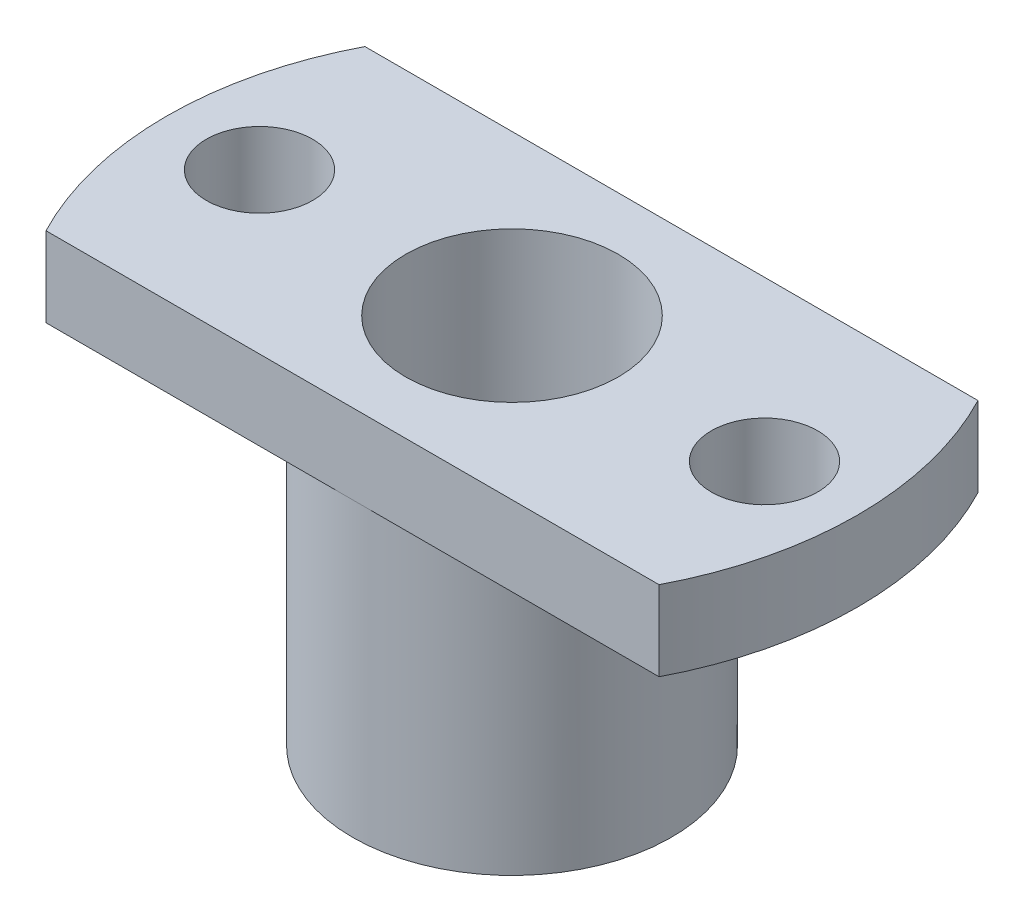
ISO-10303-21;
HEADER;
FILE_DESCRIPTION(('STEP AP214'),'2;1');
FILE_NAME('part.step','',(''),(''),'','','');
FILE_SCHEMA(('AUTOMOTIVE_DESIGN { 1 0 10303 214 1 1 1 1 }'));
ENDSEC;
DATA;
#1=APPLICATION_CONTEXT('core data for automotive mechanical design processes');
#2=APPLICATION_PROTOCOL_DEFINITION('international standard','automotive_design',2000,#1);
#3=PRODUCT_CONTEXT('',#1,'mechanical');
#4=PRODUCT('Part','Part','',(#3));
#5=PRODUCT_RELATED_PRODUCT_CATEGORY('part','',(#4));
#6=PRODUCT_DEFINITION_FORMATION('','',#4);
#7=PRODUCT_DEFINITION_CONTEXT('part definition',#1,'design');
#8=PRODUCT_DEFINITION('design','',#6,#7);
#9=PRODUCT_DEFINITION_SHAPE('','',#8);
#10=(LENGTH_UNIT() NAMED_UNIT(*) SI_UNIT(.MILLI.,.METRE.));
#11=(NAMED_UNIT(*) PLANE_ANGLE_UNIT() SI_UNIT($,.RADIAN.));
#12=(NAMED_UNIT(*) SI_UNIT($,.STERADIAN.) SOLID_ANGLE_UNIT());
#13=UNCERTAINTY_MEASURE_WITH_UNIT(LENGTH_MEASURE(1.E-05),#10,'distance_accuracy_value','');
#14=(GEOMETRIC_REPRESENTATION_CONTEXT(3) GLOBAL_UNCERTAINTY_ASSIGNED_CONTEXT((#13)) GLOBAL_UNIT_ASSIGNED_CONTEXT((#10,
#11,#12)) REPRESENTATION_CONTEXT('',''));
#15=CARTESIAN_POINT('',(0.,0.,0.));
#16=DIRECTION('',(0.,0.,1.));
#17=DIRECTION('',(1.,0.,0.));
#18=AXIS2_PLACEMENT_3D('',#15,#16,#17);
#19=CARTESIAN_POINT('',(0.,5.5,0.));
#20=DIRECTION('',(0.,-1.,0.));
#21=DIRECTION('',(0.,0.,-1.));
#22=AXIS2_PLACEMENT_3D('',#19,#20,#21);
#23=CYLINDRICAL_SURFACE('',#22,3.);
#24=CARTESIAN_POINT('',(0.,5.5,0.));
#25=DIRECTION('',(0.,1.,0.));
#26=DIRECTION('',(0.,0.,1.));
#27=AXIS2_PLACEMENT_3D('',#24,#25,#26);
#28=CIRCLE('',#27,3.);
#29=CARTESIAN_POINT('',(0.,5.5,3.));
#30=VERTEX_POINT('',#29);
#31=CARTESIAN_POINT('',(0.,5.5,-3.));
#32=VERTEX_POINT('',#31);
#33=EDGE_CURVE('E55',#30,#32,#28,.T.);
#34=ORIENTED_EDGE('',*,*,#33,.F.);
#35=EDGE_CURVE('E61',#32,#30,#28,.T.);
#36=ORIENTED_EDGE('',*,*,#35,.F.);
#37=EDGE_LOOP('',(#34,#36));
#38=FACE_BOUND('',#37,.T.);
#39=CARTESIAN_POINT('',(0.,0.,0.));
#40=DIRECTION('',(0.,1.,0.));
#41=DIRECTION('',(0.,0.,1.));
#42=AXIS2_PLACEMENT_3D('',#39,#40,#41);
#43=CIRCLE('',#42,3.);
#44=CARTESIAN_POINT('',(0.,0.,3.));
#45=VERTEX_POINT('',#44);
#46=EDGE_CURVE('E119',#45,#45,#43,.T.);
#47=ORIENTED_EDGE('',*,*,#46,.T.);
#48=EDGE_LOOP('',(#47));
#49=FACE_BOUND('',#48,.T.);
#50=ADVANCED_FACE('F45',(#38,#49),#23,.T.);
#51=CARTESIAN_POINT('',(0.,5.5,0.));
#52=DIRECTION('',(0.,-1.,0.));
#53=DIRECTION('',(0.,0.,-1.));
#54=AXIS2_PLACEMENT_3D('',#51,#52,#53);
#55=CYLINDRICAL_SURFACE('',#54,2.);
#56=CARTESIAN_POINT('',(0.,1.,0.));
#57=DIRECTION('',(0.,1.,0.));
#58=DIRECTION('',(0.,0.,1.));
#59=AXIS2_PLACEMENT_3D('',#56,#57,#58);
#60=CIRCLE('',#59,2.);
#61=CARTESIAN_POINT('',(0.,1.,2.));
#62=VERTEX_POINT('',#61);
#63=EDGE_CURVE('E11',#62,#62,#60,.F.);
#64=ORIENTED_EDGE('',*,*,#63,.T.);
#65=EDGE_LOOP('',(#64));
#66=FACE_BOUND('',#65,.T.);
#67=CARTESIAN_POINT('',(0.,7.,0.));
#68=DIRECTION('',(0.,1.,0.));
#69=DIRECTION('',(0.,0.,1.));
#70=AXIS2_PLACEMENT_3D('',#67,#68,#69);
#71=CIRCLE('',#70,2.);
#72=CARTESIAN_POINT('',(0.,7.,2.));
#73=VERTEX_POINT('',#72);
#74=EDGE_CURVE('E130',#73,#73,#71,.T.);
#75=ORIENTED_EDGE('',*,*,#74,.T.);
#76=EDGE_LOOP('',(#75));
#77=FACE_BOUND('',#76,.T.);
#78=ADVANCED_FACE('F194',(#66,#77),#55,.F.);
#79=CARTESIAN_POINT('',(0.,5.5,0.));
#80=DIRECTION('',(0.,1.,0.));
#81=DIRECTION('',(0.,0.,1.));
#82=AXIS2_PLACEMENT_3D('',#79,#80,#81);
#83=PLANE('',#82);
#84=CARTESIAN_POINT('',(4.75,5.5,0.));
#85=DIRECTION('',(0.,1.,0.));
#86=DIRECTION('',(0.,0.,1.));
#87=AXIS2_PLACEMENT_3D('',#84,#85,#86);
#88=CIRCLE('',#87,1.);
#89=CARTESIAN_POINT('',(4.75,5.5,0.999999999999998));
#90=VERTEX_POINT('',#89);
#91=EDGE_CURVE('E141',#90,#90,#88,.T.);
#92=ORIENTED_EDGE('',*,*,#91,.T.);
#93=EDGE_LOOP('',(#92));
#94=FACE_BOUND('',#93,.T.);
#95=DIRECTION('',(1.,0.,0.));
#96=VECTOR('',#95,1.);
#97=CARTESIAN_POINT('',(5.7662812973354,5.5,3.));
#98=LINE('',#97,#96);
#99=CARTESIAN_POINT('',(5.7662812973354,5.5,3.));
#100=VERTEX_POINT('',#99);
#101=EDGE_CURVE('E162',#30,#100,#98,.T.);
#102=ORIENTED_EDGE('',*,*,#101,.F.);
#103=ORIENTED_EDGE('',*,*,#33,.T.);
#104=DIRECTION('',(-1.,0.,0.));
#105=VECTOR('',#104,1.);
#106=CARTESIAN_POINT('',(5.7662812973354,5.5,-3.));
#107=LINE('',#106,#105);
#108=CARTESIAN_POINT('',(5.7662812973354,5.5,-3.));
#109=VERTEX_POINT('',#108);
#110=EDGE_CURVE('E156',#109,#32,#107,.T.);
#111=ORIENTED_EDGE('',*,*,#110,.F.);
#112=CARTESIAN_POINT('',(0.,5.5,0.));
#113=DIRECTION('',(0.,1.,0.));
#114=DIRECTION('',(0.,0.,1.));
#115=AXIS2_PLACEMENT_3D('',#112,#113,#114);
#116=CIRCLE('',#115,6.5);
#117=EDGE_CURVE('E117',#100,#109,#116,.T.);
#118=ORIENTED_EDGE('',*,*,#117,.F.);
#119=EDGE_LOOP('',(#102,#103,#111,#118));
#120=FACE_BOUND('',#119,.T.);
#121=ADVANCED_FACE('F181',(#94,#120),#83,.F.);
#122=CARTESIAN_POINT('',(-4.75,5.5,0.));
#123=DIRECTION('',(0.,1.,0.));
#124=DIRECTION('',(0.,0.,1.));
#125=AXIS2_PLACEMENT_3D('',#122,#123,#124);
#126=CIRCLE('',#125,1.);
#127=CARTESIAN_POINT('',(-4.75,5.5,1.));
#128=VERTEX_POINT('',#127);
#129=EDGE_CURVE('E133',#128,#128,#126,.T.);
#130=ORIENTED_EDGE('',*,*,#129,.T.);
#131=EDGE_LOOP('',(#130));
#132=FACE_BOUND('',#131,.T.);
#133=CARTESIAN_POINT('',(-5.7662812973354,5.5,-3.));
#134=VERTEX_POINT('',#133);
#135=EDGE_CURVE('E138',#32,#134,#107,.T.);
#136=ORIENTED_EDGE('',*,*,#135,.F.);
#137=ORIENTED_EDGE('',*,*,#35,.T.);
#138=CARTESIAN_POINT('',(-5.7662812973354,5.5,3.));
#139=VERTEX_POINT('',#138);
#140=EDGE_CURVE('E113',#139,#30,#98,.T.);
#141=ORIENTED_EDGE('',*,*,#140,.F.);
#142=CARTESIAN_POINT('',(0.,5.5,0.));
#143=DIRECTION('',(0.,1.,0.));
#144=DIRECTION('',(0.,0.,1.));
#145=AXIS2_PLACEMENT_3D('',#142,#143,#144);
#146=CIRCLE('',#145,6.5);
#147=EDGE_CURVE('E159',#134,#139,#146,.T.);
#148=ORIENTED_EDGE('',*,*,#147,.F.);
#149=EDGE_LOOP('',(#136,#137,#141,#148));
#150=FACE_BOUND('',#149,.T.);
#151=ADVANCED_FACE('F177',(#132,#150),#83,.F.);
#152=CARTESIAN_POINT('',(0.,7.,0.));
#153=DIRECTION('',(0.,-1.,0.));
#154=DIRECTION('',(0.,0.,-1.));
#155=AXIS2_PLACEMENT_3D('',#152,#153,#154);
#156=CYLINDRICAL_SURFACE('',#155,6.5);
#157=ORIENTED_EDGE('',*,*,#117,.T.);
#158=DIRECTION('',(0.,-1.,0.));
#159=VECTOR('',#158,1.);
#160=CARTESIAN_POINT('',(5.7662812973354,7.,-3.));
#161=LINE('',#160,#159);
#162=CARTESIAN_POINT('',(5.7662812973354,7.,-3.));
#163=VERTEX_POINT('',#162);
#164=EDGE_CURVE('E95',#163,#109,#161,.T.);
#165=ORIENTED_EDGE('',*,*,#164,.F.);
#166=CARTESIAN_POINT('',(0.,7.,0.));
#167=DIRECTION('',(0.,1.,0.));
#168=DIRECTION('',(0.,0.,1.));
#169=AXIS2_PLACEMENT_3D('',#166,#167,#168);
#170=CIRCLE('',#169,6.5);
#171=CARTESIAN_POINT('',(5.7662812973354,7.,3.));
#172=VERTEX_POINT('',#171);
#173=EDGE_CURVE('E103',#172,#163,#170,.T.);
#174=ORIENTED_EDGE('',*,*,#173,.F.);
#175=DIRECTION('',(0.,-1.,0.));
#176=VECTOR('',#175,1.);
#177=CARTESIAN_POINT('',(5.7662812973354,7.,3.));
#178=LINE('',#177,#176);
#179=EDGE_CURVE('E154',#172,#100,#178,.T.);
#180=ORIENTED_EDGE('',*,*,#179,.T.);
#181=EDGE_LOOP('',(#157,#165,#174,#180));
#182=FACE_BOUND('',#181,.T.);
#183=ADVANCED_FACE('F115',(#182),#156,.T.);
#184=CARTESIAN_POINT('',(5.7662812973354,7.,-3.));
#185=DIRECTION('',(0.,0.,1.));
#186=DIRECTION('',(1.,0.,0.));
#187=AXIS2_PLACEMENT_3D('',#184,#185,#186);
#188=PLANE('',#187);
#189=ORIENTED_EDGE('',*,*,#110,.T.);
#190=ORIENTED_EDGE('',*,*,#135,.T.);
#191=DIRECTION('',(0.,-1.,0.));
#192=VECTOR('',#191,1.);
#193=CARTESIAN_POINT('',(-5.7662812973354,7.,-3.));
#194=LINE('',#193,#192);
#195=CARTESIAN_POINT('',(-5.7662812973354,7.,-3.));
#196=VERTEX_POINT('',#195);
#197=EDGE_CURVE('E98',#196,#134,#194,.T.);
#198=ORIENTED_EDGE('',*,*,#197,.F.);
#199=DIRECTION('',(-1.,0.,0.));
#200=VECTOR('',#199,1.);
#201=CARTESIAN_POINT('',(5.7662812973354,7.,-3.));
#202=LINE('',#201,#200);
#203=EDGE_CURVE('E90',#163,#196,#202,.T.);
#204=ORIENTED_EDGE('',*,*,#203,.F.);
#205=ORIENTED_EDGE('',*,*,#164,.T.);
#206=EDGE_LOOP('',(#189,#190,#198,#204,#205));
#207=FACE_BOUND('',#206,.T.);
#208=ADVANCED_FACE('F93',(#207),#188,.F.);
#209=CARTESIAN_POINT('',(0.,7.,0.));
#210=DIRECTION('',(0.,-1.,0.));
#211=DIRECTION('',(0.,0.,-1.));
#212=AXIS2_PLACEMENT_3D('',#209,#210,#211);
#213=CYLINDRICAL_SURFACE('',#212,6.5);
#214=ORIENTED_EDGE('',*,*,#147,.T.);
#215=DIRECTION('',(0.,-1.,0.));
#216=VECTOR('',#215,1.);
#217=CARTESIAN_POINT('',(-5.7662812973354,7.,3.));
#218=LINE('',#217,#216);
#219=CARTESIAN_POINT('',(-5.7662812973354,7.,3.));
#220=VERTEX_POINT('',#219);
#221=EDGE_CURVE('E125',#220,#139,#218,.T.);
#222=ORIENTED_EDGE('',*,*,#221,.F.);
#223=CARTESIAN_POINT('',(0.,7.,0.));
#224=DIRECTION('',(0.,1.,0.));
#225=DIRECTION('',(0.,0.,1.));
#226=AXIS2_PLACEMENT_3D('',#223,#224,#225);
#227=CIRCLE('',#226,6.5);
#228=EDGE_CURVE('E102',#196,#220,#227,.T.);
#229=ORIENTED_EDGE('',*,*,#228,.F.);
#230=ORIENTED_EDGE('',*,*,#197,.T.);
#231=EDGE_LOOP('',(#214,#222,#229,#230));
#232=FACE_BOUND('',#231,.T.);
#233=ADVANCED_FACE('F184',(#232),#213,.T.);
#234=CARTESIAN_POINT('',(5.7662812973354,7.,3.));
#235=DIRECTION('',(0.,0.,-1.));
#236=DIRECTION('',(-1.,0.,0.));
#237=AXIS2_PLACEMENT_3D('',#234,#235,#236);
#238=PLANE('',#237);
#239=ORIENTED_EDGE('',*,*,#140,.T.);
#240=ORIENTED_EDGE('',*,*,#101,.T.);
#241=ORIENTED_EDGE('',*,*,#179,.F.);
#242=DIRECTION('',(1.,0.,0.));
#243=VECTOR('',#242,1.);
#244=CARTESIAN_POINT('',(5.7662812973354,7.,3.));
#245=LINE('',#244,#243);
#246=EDGE_CURVE('E108',#220,#172,#245,.T.);
#247=ORIENTED_EDGE('',*,*,#246,.F.);
#248=ORIENTED_EDGE('',*,*,#221,.T.);
#249=EDGE_LOOP('',(#239,#240,#241,#247,#248));
#250=FACE_BOUND('',#249,.T.);
#251=ADVANCED_FACE('F172',(#250),#238,.F.);
#252=CARTESIAN_POINT('',(0.,7.,0.));
#253=DIRECTION('',(0.,1.,0.));
#254=DIRECTION('',(0.,0.,1.));
#255=AXIS2_PLACEMENT_3D('',#252,#253,#254);
#256=PLANE('',#255);
#257=CARTESIAN_POINT('',(-4.75,7.,0.));
#258=DIRECTION('',(0.,1.,0.));
#259=DIRECTION('',(0.,0.,1.));
#260=AXIS2_PLACEMENT_3D('',#257,#258,#259);
#261=CIRCLE('',#260,1.);
#262=CARTESIAN_POINT('',(-4.75,7.,1.));
#263=VERTEX_POINT('',#262);
#264=EDGE_CURVE('E147',#263,#263,#261,.T.);
#265=ORIENTED_EDGE('',*,*,#264,.F.);
#266=EDGE_LOOP('',(#265));
#267=FACE_BOUND('',#266,.T.);
#268=CARTESIAN_POINT('',(4.75,7.,0.));
#269=DIRECTION('',(0.,1.,0.));
#270=DIRECTION('',(0.,0.,1.));
#271=AXIS2_PLACEMENT_3D('',#268,#269,#270);
#272=CIRCLE('',#271,1.);
#273=CARTESIAN_POINT('',(4.75,7.,0.999999999999998));
#274=VERTEX_POINT('',#273);
#275=EDGE_CURVE('E230',#274,#274,#272,.T.);
#276=ORIENTED_EDGE('',*,*,#275,.F.);
#277=EDGE_LOOP('',(#276));
#278=FACE_BOUND('',#277,.T.);
#279=ORIENTED_EDGE('',*,*,#74,.F.);
#280=EDGE_LOOP('',(#279));
#281=FACE_BOUND('',#280,.T.);
#282=ORIENTED_EDGE('',*,*,#173,.T.);
#283=ORIENTED_EDGE('',*,*,#203,.T.);
#284=ORIENTED_EDGE('',*,*,#228,.T.);
#285=ORIENTED_EDGE('',*,*,#246,.T.);
#286=EDGE_LOOP('',(#282,#283,#284,#285));
#287=FACE_BOUND('',#286,.T.);
#288=ADVANCED_FACE('F106',(#267,#278,#281,#287),#256,.T.);
#289=CARTESIAN_POINT('',(4.75,-4.5,0.));
#290=DIRECTION('',(0.,1.,0.));
#291=DIRECTION('',(0.,0.,1.));
#292=AXIS2_PLACEMENT_3D('',#289,#290,#291);
#293=CYLINDRICAL_SURFACE('',#292,1.);
#294=ORIENTED_EDGE('',*,*,#275,.T.);
#295=EDGE_LOOP('',(#294));
#296=FACE_BOUND('',#295,.T.);
#297=ORIENTED_EDGE('',*,*,#91,.F.);
#298=EDGE_LOOP('',(#297));
#299=FACE_BOUND('',#298,.T.);
#300=ADVANCED_FACE('F214',(#296,#299),#293,.F.);
#301=CARTESIAN_POINT('',(-4.75,-4.5,0.));
#302=DIRECTION('',(0.,1.,0.));
#303=DIRECTION('',(0.,0.,1.));
#304=AXIS2_PLACEMENT_3D('',#301,#302,#303);
#305=CYLINDRICAL_SURFACE('',#304,1.);
#306=ORIENTED_EDGE('',*,*,#264,.T.);
#307=EDGE_LOOP('',(#306));
#308=FACE_BOUND('',#307,.T.);
#309=ORIENTED_EDGE('',*,*,#129,.F.);
#310=EDGE_LOOP('',(#309));
#311=FACE_BOUND('',#310,.T.);
#312=ADVANCED_FACE('F218',(#308,#311),#305,.F.);
#313=CARTESIAN_POINT('',(0.,0.,0.));
#314=DIRECTION('',(0.,-1.,0.));
#315=DIRECTION('',(0.,0.,-1.));
#316=AXIS2_PLACEMENT_3D('',#313,#314,#315);
#317=CONICAL_SURFACE('',#316,3.,0.785398163397447);
#318=ORIENTED_EDGE('',*,*,#63,.F.);
#319=EDGE_LOOP('',(#318));
#320=FACE_BOUND('',#319,.T.);
#321=ORIENTED_EDGE('',*,*,#46,.F.);
#322=EDGE_LOOP('',(#321));
#323=FACE_BOUND('',#322,.T.);
#324=ADVANCED_FACE('F48',(#320,#323),#317,.F.);
#325=CLOSED_SHELL('',(#50,#78,#121,#151,#183,#208,#233,#251,#288,#300,#312,#324));
#326=MANIFOLD_SOLID_BREP('B2',#325);
#327=ADVANCED_BREP_SHAPE_REPRESENTATION('',(#18,#326),#14);
#328=SHAPE_DEFINITION_REPRESENTATION(#9,#327);
ENDSEC;
END-ISO-10303-21;
